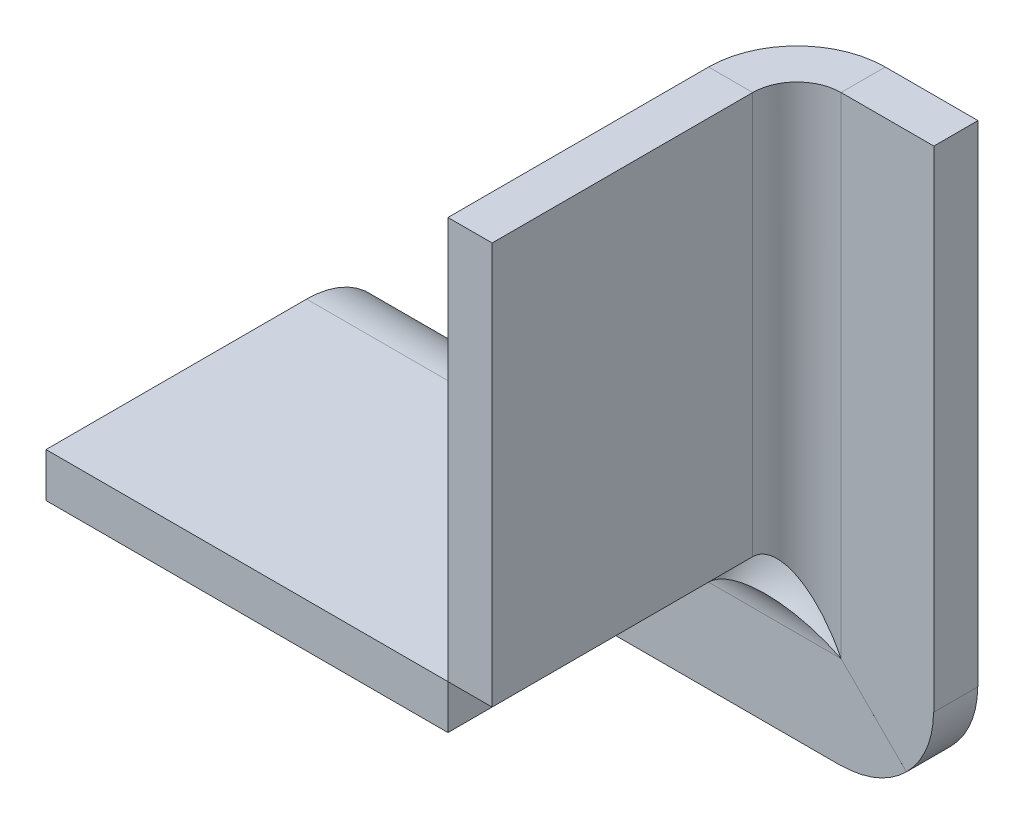
ISO-10303-21;
HEADER;
FILE_DESCRIPTION(('STEP AP214'),'2;1');
FILE_NAME('part.step','',(''),(''),'','','');
FILE_SCHEMA(('AUTOMOTIVE_DESIGN { 1 0 10303 214 1 1 1 1 }'));
ENDSEC;
DATA;
#1=APPLICATION_CONTEXT('core data for automotive mechanical design processes');
#2=APPLICATION_PROTOCOL_DEFINITION('international standard','automotive_design',2000,#1);
#3=PRODUCT_CONTEXT('',#1,'mechanical');
#4=PRODUCT('Part','Part','',(#3));
#5=PRODUCT_RELATED_PRODUCT_CATEGORY('part','',(#4));
#6=PRODUCT_DEFINITION_FORMATION('','',#4);
#7=PRODUCT_DEFINITION_CONTEXT('part definition',#1,'design');
#8=PRODUCT_DEFINITION('design','',#6,#7);
#9=PRODUCT_DEFINITION_SHAPE('','',#8);
#10=(LENGTH_UNIT() NAMED_UNIT(*) SI_UNIT(.MILLI.,.METRE.));
#11=(NAMED_UNIT(*) PLANE_ANGLE_UNIT() SI_UNIT($,.RADIAN.));
#12=(NAMED_UNIT(*) SI_UNIT($,.STERADIAN.) SOLID_ANGLE_UNIT());
#13=UNCERTAINTY_MEASURE_WITH_UNIT(LENGTH_MEASURE(1.E-05),#10,'distance_accuracy_value','');
#14=(GEOMETRIC_REPRESENTATION_CONTEXT(3) GLOBAL_UNCERTAINTY_ASSIGNED_CONTEXT((#13)) GLOBAL_UNIT_ASSIGNED_CONTEXT((#10,
#11,#12)) REPRESENTATION_CONTEXT('',''));
#15=CARTESIAN_POINT('',(0.,0.,0.));
#16=DIRECTION('',(0.,0.,1.));
#17=DIRECTION('',(1.,0.,0.));
#18=AXIS2_PLACEMENT_3D('',#15,#16,#17);
#19=CARTESIAN_POINT('',(0.,0.,-35.56));
#20=DIRECTION('',(-1.,0.,0.));
#21=DIRECTION('',(0.,0.,1.));
#22=AXIS2_PLACEMENT_3D('',#19,#20,#21);
#23=PLANE('',#22);
#24=DIRECTION('',(0.,-1.,0.));
#25=VECTOR('',#24,1.);
#26=CARTESIAN_POINT('',(0.,0.,-20.574));
#27=LINE('',#26,#25);
#28=CARTESIAN_POINT('',(0.,0.,-20.574));
#29=VERTEX_POINT('',#28);
#30=CARTESIAN_POINT('',(0.,2.54,-20.574));
#31=VERTEX_POINT('',#30);
#32=EDGE_CURVE('E149',#29,#31,#27,.F.);
#33=ORIENTED_EDGE('',*,*,#32,.T.);
#34=DIRECTION('',(0.,0.,1.));
#35=VECTOR('',#34,1.);
#36=CARTESIAN_POINT('',(0.,2.54,-35.56));
#37=LINE('',#36,#35);
#38=CARTESIAN_POINT('',(0.,2.54,-35.56));
#39=VERTEX_POINT('',#38);
#40=EDGE_CURVE('E179',#39,#31,#37,.T.);
#41=ORIENTED_EDGE('',*,*,#40,.F.);
#42=DIRECTION('',(0.,-1.,0.));
#43=VECTOR('',#42,1.);
#44=CARTESIAN_POINT('',(0.,0.,-35.56));
#45=LINE('',#44,#43);
#46=CARTESIAN_POINT('',(0.,0.,-35.56));
#47=VERTEX_POINT('',#46);
#48=EDGE_CURVE('E159',#47,#39,#45,.F.);
#49=ORIENTED_EDGE('',*,*,#48,.F.);
#50=DIRECTION('',(0.,0.,1.));
#51=VECTOR('',#50,1.);
#52=CARTESIAN_POINT('',(0.,0.,-35.56));
#53=LINE('',#52,#51);
#54=EDGE_CURVE('E152',#47,#29,#53,.T.);
#55=ORIENTED_EDGE('',*,*,#54,.T.);
#56=EDGE_LOOP('',(#33,#41,#49,#55));
#57=FACE_BOUND('',#56,.T.);
#58=ADVANCED_FACE('F55',(#57),#23,.T.);
#59=CARTESIAN_POINT('',(23.1138203948714,0.,-35.56));
#60=DIRECTION('',(-1.,0.,0.));
#61=DIRECTION('',(0.,0.,1.));
#62=AXIS2_PLACEMENT_3D('',#59,#60,#61);
#63=PLANE('',#62);
#64=DIRECTION('',(0.,-1.,0.));
#65=VECTOR('',#64,1.);
#66=CARTESIAN_POINT('',(23.1138203948714,0.,-20.574));
#67=LINE('',#66,#65);
#68=CARTESIAN_POINT('',(23.1138203948714,2.54,-20.574));
#69=VERTEX_POINT('',#68);
#70=CARTESIAN_POINT('',(23.1138203948714,0.,-20.574));
#71=VERTEX_POINT('',#70);
#72=EDGE_CURVE('E78',#69,#71,#67,.T.);
#73=ORIENTED_EDGE('',*,*,#72,.T.);
#74=DIRECTION('',(0.,0.,1.));
#75=VECTOR('',#74,1.);
#76=CARTESIAN_POINT('',(23.1138203948714,0.,-35.56));
#77=LINE('',#76,#75);
#78=CARTESIAN_POINT('',(23.1138203948841,0.,-35.56));
#79=VERTEX_POINT('',#78);
#80=EDGE_CURVE('E180',#71,#79,#77,.F.);
#81=ORIENTED_EDGE('',*,*,#80,.T.);
#82=DIRECTION('',(0.,-1.,0.));
#83=VECTOR('',#82,1.);
#84=CARTESIAN_POINT('',(23.1138203948841,0.,-35.56));
#85=LINE('',#84,#83);
#86=CARTESIAN_POINT('',(23.1138203948841,2.54,-35.56));
#87=VERTEX_POINT('',#86);
#88=EDGE_CURVE('E176',#79,#87,#85,.F.);
#89=ORIENTED_EDGE('',*,*,#88,.T.);
#90=DIRECTION('',(0.,0.,1.));
#91=VECTOR('',#90,1.);
#92=CARTESIAN_POINT('',(23.1138203948714,2.54,-35.56));
#93=LINE('',#92,#91);
#94=EDGE_CURVE('E208',#69,#87,#93,.F.);
#95=ORIENTED_EDGE('',*,*,#94,.F.);
#96=EDGE_LOOP('',(#73,#81,#89,#95));
#97=FACE_BOUND('',#96,.T.);
#98=ADVANCED_FACE('F261',(#97),#63,.F.);
#99=CARTESIAN_POINT('',(0.,2.54,-35.56));
#100=DIRECTION('',(0.,1.,0.));
#101=DIRECTION('',(0.,0.,1.));
#102=AXIS2_PLACEMENT_3D('',#99,#100,#101);
#103=PLANE('',#102);
#104=ORIENTED_EDGE('',*,*,#40,.T.);
#105=DIRECTION('',(-1.,0.,0.));
#106=VECTOR('',#105,1.);
#107=CARTESIAN_POINT('',(0.,2.54,-20.574));
#108=LINE('',#107,#106);
#109=EDGE_CURVE('E191',#69,#31,#108,.T.);
#110=ORIENTED_EDGE('',*,*,#109,.F.);
#111=ORIENTED_EDGE('',*,*,#94,.T.);
#112=DIRECTION('',(1.,0.,0.));
#113=VECTOR('',#112,1.);
#114=CARTESIAN_POINT('',(0.,2.54,-35.56));
#115=LINE('',#114,#113);
#116=EDGE_CURVE('E217',#39,#87,#115,.T.);
#117=ORIENTED_EDGE('',*,*,#116,.F.);
#118=EDGE_LOOP('',(#104,#110,#111,#117));
#119=FACE_BOUND('',#118,.T.);
#120=ADVANCED_FACE('F258',(#119),#103,.T.);
#121=CARTESIAN_POINT('',(0.,0.,-35.56));
#122=DIRECTION('',(0.,1.,0.));
#123=DIRECTION('',(0.,0.,1.));
#124=AXIS2_PLACEMENT_3D('',#121,#122,#123);
#125=PLANE('',#124);
#126=DIRECTION('',(-1.,0.,0.));
#127=VECTOR('',#126,1.);
#128=CARTESIAN_POINT('',(0.,0.,-20.574));
#129=LINE('',#128,#127);
#130=EDGE_CURVE('E205',#71,#29,#129,.T.);
#131=ORIENTED_EDGE('',*,*,#130,.T.);
#132=ORIENTED_EDGE('',*,*,#54,.F.);
#133=DIRECTION('',(1.,0.,0.));
#134=VECTOR('',#133,1.);
#135=CARTESIAN_POINT('',(0.,0.,-35.56));
#136=LINE('',#135,#134);
#137=EDGE_CURVE('E163',#47,#79,#136,.T.);
#138=ORIENTED_EDGE('',*,*,#137,.T.);
#139=ORIENTED_EDGE('',*,*,#80,.F.);
#140=EDGE_LOOP('',(#131,#132,#138,#139));
#141=FACE_BOUND('',#140,.T.);
#142=ADVANCED_FACE('F264',(#141),#125,.F.);
#143=CARTESIAN_POINT('',(0.,-2.54,-35.56));
#144=DIRECTION('',(-1.,0.,0.));
#145=DIRECTION('',(0.,0.,1.));
#146=AXIS2_PLACEMENT_3D('',#143,#144,#145);
#147=PLANE('',#146);
#148=ORIENTED_EDGE('',*,*,#48,.T.);
#149=CARTESIAN_POINT('',(0.,-2.54,-35.56));
#150=DIRECTION('',(1.,0.,0.));
#151=DIRECTION('',(0.,0.,-1.));
#152=AXIS2_PLACEMENT_3D('',#149,#150,#151);
#153=CIRCLE('',#152,5.08);
#154=CARTESIAN_POINT('',(0.,-2.54000000000001,-40.64));
#155=VERTEX_POINT('',#154);
#156=EDGE_CURVE('E162',#39,#155,#153,.F.);
#157=ORIENTED_EDGE('',*,*,#156,.T.);
#158=DIRECTION('',(0.,0.,1.));
#159=VECTOR('',#158,1.);
#160=CARTESIAN_POINT('',(0.,-2.54000000000001,-38.1));
#161=LINE('',#160,#159);
#162=CARTESIAN_POINT('',(0.,-2.54000000000001,-38.1));
#163=VERTEX_POINT('',#162);
#164=EDGE_CURVE('E164',#163,#155,#161,.F.);
#165=ORIENTED_EDGE('',*,*,#164,.F.);
#166=CARTESIAN_POINT('',(0.,-2.54,-35.56));
#167=DIRECTION('',(1.,0.,0.));
#168=DIRECTION('',(0.,0.,-1.));
#169=AXIS2_PLACEMENT_3D('',#166,#167,#168);
#170=CIRCLE('',#169,2.54);
#171=EDGE_CURVE('E183',#47,#163,#170,.F.);
#172=ORIENTED_EDGE('',*,*,#171,.F.);
#173=EDGE_LOOP('',(#148,#157,#165,#172));
#174=FACE_BOUND('',#173,.T.);
#175=ADVANCED_FACE('F253',(#174),#147,.T.);
#176=CARTESIAN_POINT('',(0.,0.,-38.1));
#177=DIRECTION('',(-1.,0.,0.));
#178=DIRECTION('',(0.,-1.,0.));
#179=AXIS2_PLACEMENT_3D('',#176,#177,#178);
#180=PLANE('',#179);
#181=ORIENTED_EDGE('',*,*,#164,.T.);
#182=DIRECTION('',(0.,-1.,0.));
#183=VECTOR('',#182,1.);
#184=CARTESIAN_POINT('',(0.,0.,-40.64));
#185=LINE('',#184,#183);
#186=CARTESIAN_POINT('',(0.,-7.87400000000001,-40.64));
#187=VERTEX_POINT('',#186);
#188=EDGE_CURVE('E167',#155,#187,#185,.T.);
#189=ORIENTED_EDGE('',*,*,#188,.T.);
#190=DIRECTION('',(0.,0.,1.));
#191=VECTOR('',#190,1.);
#192=CARTESIAN_POINT('',(0.,-7.874,-38.1));
#193=LINE('',#192,#191);
#194=CARTESIAN_POINT('',(0.,-7.874,-38.1));
#195=VERTEX_POINT('',#194);
#196=EDGE_CURVE('E168',#195,#187,#193,.F.);
#197=ORIENTED_EDGE('',*,*,#196,.F.);
#198=DIRECTION('',(0.,-1.,0.));
#199=VECTOR('',#198,1.);
#200=CARTESIAN_POINT('',(0.,0.,-38.1));
#201=LINE('',#200,#199);
#202=EDGE_CURVE('E188',#163,#195,#201,.T.);
#203=ORIENTED_EDGE('',*,*,#202,.F.);
#204=EDGE_LOOP('',(#181,#189,#197,#203));
#205=FACE_BOUND('',#204,.T.);
#206=ADVANCED_FACE('F233',(#205),#180,.T.);
#207=CARTESIAN_POINT('',(0.,-7.874,-38.1));
#208=DIRECTION('',(0.,-1.,0.));
#209=DIRECTION('',(1.,0.,0.));
#210=AXIS2_PLACEMENT_3D('',#207,#208,#209);
#211=PLANE('',#210);
#212=DIRECTION('',(1.,0.,0.));
#213=VECTOR('',#212,1.);
#214=CARTESIAN_POINT('',(0.,-7.87400000000001,-40.64));
#215=LINE('',#214,#213);
#216=CARTESIAN_POINT('',(28.1938203948577,-7.87400000000001,-40.64));
#217=VERTEX_POINT('',#216);
#218=EDGE_CURVE('E171',#187,#217,#215,.T.);
#219=ORIENTED_EDGE('',*,*,#218,.T.);
#220=DIRECTION('',(0.,0.,-1.));
#221=VECTOR('',#220,1.);
#222=CARTESIAN_POINT('',(28.1938203948577,-7.874,-38.1));
#223=LINE('',#222,#221);
#224=CARTESIAN_POINT('',(28.1938203948577,-7.874,-38.1));
#225=VERTEX_POINT('',#224);
#226=EDGE_CURVE('E132',#217,#225,#223,.F.);
#227=ORIENTED_EDGE('',*,*,#226,.T.);
#228=DIRECTION('',(1.,0.,0.));
#229=VECTOR('',#228,1.);
#230=CARTESIAN_POINT('',(0.,-7.874,-38.1));
#231=LINE('',#230,#229);
#232=EDGE_CURVE('E186',#195,#225,#231,.T.);
#233=ORIENTED_EDGE('',*,*,#232,.F.);
#234=ORIENTED_EDGE('',*,*,#196,.T.);
#235=EDGE_LOOP('',(#219,#227,#233,#234));
#236=FACE_BOUND('',#235,.T.);
#237=ADVANCED_FACE('F227',(#236),#211,.T.);
#238=CARTESIAN_POINT('',(12.8269101974288,12.8269101974288,-38.1));
#239=DIRECTION('',(0.707106781186547,0.707106781186548,0.));
#240=DIRECTION('',(-0.707106781186548,0.707106781186547,0.));
#241=AXIS2_PLACEMENT_3D('',#238,#239,#240);
#242=PLANE('',#241);
#243=DIRECTION('',(-0.707106781186548,0.707106781186547,0.));
#244=VECTOR('',#243,1.);
#245=CARTESIAN_POINT('',(12.8269101974288,12.8269101974288,-38.1));
#246=LINE('',#245,#244);
#247=CARTESIAN_POINT('',(31.9529549657332,-6.29913457087551,-38.1));
#248=VERTEX_POINT('',#247);
#249=CARTESIAN_POINT('',(28.1938203948577,-2.54000000000001,-38.1));
#250=VERTEX_POINT('',#249);
#251=EDGE_CURVE('E192',#248,#250,#246,.T.);
#252=ORIENTED_EDGE('',*,*,#251,.F.);
#253=DIRECTION('',(0.,0.,-1.));
#254=VECTOR('',#253,1.);
#255=CARTESIAN_POINT('',(31.9529549657332,-6.2991345708755,-20.574));
#256=LINE('',#255,#254);
#257=CARTESIAN_POINT('',(31.9529549657332,-6.29913457087552,-40.64));
#258=VERTEX_POINT('',#257);
#259=EDGE_CURVE('E136',#248,#258,#256,.T.);
#260=ORIENTED_EDGE('',*,*,#259,.T.);
#261=DIRECTION('',(-0.707106781186548,0.707106781186547,0.));
#262=VECTOR('',#261,1.);
#263=CARTESIAN_POINT('',(12.8269101974288,12.8269101974288,-40.64));
#264=LINE('',#263,#262);
#265=CARTESIAN_POINT('',(28.1938203948577,-2.54000000000001,-40.64));
#266=VERTEX_POINT('',#265);
#267=EDGE_CURVE('E148',#258,#266,#264,.T.);
#268=ORIENTED_EDGE('',*,*,#267,.T.);
#269=DIRECTION('',(0.,0.,1.));
#270=VECTOR('',#269,1.);
#271=CARTESIAN_POINT('',(28.1938203948577,-2.54000000000001,-38.1));
#272=LINE('',#271,#270);
#273=EDGE_CURVE('E172',#250,#266,#272,.F.);
#274=ORIENTED_EDGE('',*,*,#273,.F.);
#275=EDGE_LOOP('',(#252,#260,#268,#274));
#276=FACE_BOUND('',#275,.T.);
#277=ADVANCED_FACE('F247',(#276),#242,.T.);
#278=CARTESIAN_POINT('',(33.2738203948841,-5.08,-35.56));
#279=CARTESIAN_POINT('',(33.2738203948841,-5.92666666666667,-35.56));
#280=CARTESIAN_POINT('',(33.2738203948841,-6.77333333333334,-35.56));
#281=CARTESIAN_POINT('',(33.2738203948841,-7.62000000000001,-35.56));
#282=CARTESIAN_POINT('',(33.2738203948841,-5.08,-40.64));
#283=CARTESIAN_POINT('',(33.2738203948841,-5.92666666666667,-42.3333333333333));
#284=CARTESIAN_POINT('',(33.2738203948841,-6.77333333333334,-44.0266666666667));
#285=CARTESIAN_POINT('',(33.2738203948841,-7.62000000000001,-45.72));
#286=CARTESIAN_POINT('',(23.1138203948841,0.,-40.64));
#287=CARTESIAN_POINT('',(23.1138203948841,0.846666666666661,-42.3333333333333));
#288=CARTESIAN_POINT('',(23.1138203948841,1.69333333333333,-44.0266666666667));
#289=CARTESIAN_POINT('',(23.1138203948841,2.53999999999999,-45.72));
#290=CARTESIAN_POINT('',(23.1138203948841,0.,-35.56));
#291=CARTESIAN_POINT('',(23.1138203948841,0.846666666666662,-35.56));
#292=CARTESIAN_POINT('',(23.1138203948841,1.69333333333333,-35.56));
#293=CARTESIAN_POINT('',(23.1138203948841,2.54,-35.56));
#294=CARTESIAN_POINT('',(23.1138203948841,0.,-30.48));
#295=CARTESIAN_POINT('',(23.1138203948841,0.846666666666663,-28.7866666666667));
#296=CARTESIAN_POINT('',(23.1138203948841,1.69333333333333,-27.0933333333333));
#297=CARTESIAN_POINT('',(23.1138203948841,2.54,-25.4));
#298=CARTESIAN_POINT('',(33.2738203948841,-5.08,-30.48));
#299=CARTESIAN_POINT('',(33.2738203948841,-5.92666666666667,-28.7866666666667));
#300=CARTESIAN_POINT('',(33.2738203948841,-6.77333333333334,-27.0933333333333));
#301=CARTESIAN_POINT('',(33.2738203948841,-7.62000000000001,-25.4));
#302=CARTESIAN_POINT('',(33.2738203948841,-5.08,-35.56));
#303=CARTESIAN_POINT('',(33.2738203948841,-5.92666666666667,-35.56));
#304=CARTESIAN_POINT('',(33.2738203948841,-6.77333333333334,-35.56));
#305=CARTESIAN_POINT('',(33.2738203948841,-7.62000000000001,-35.56));
#306=(BOUNDED_SURFACE() B_SPLINE_SURFACE(3,3,((#278,#279,#280,#281),(#282,#283,#284,#285),(#286,
#287,#288,#289),(#290,#291,#292,#293),(#294,#295,#296,#297),(#298,#299,#300,#301),(#302,#303,
#304,#305)),.UNSPECIFIED.,.T.,.F.,.F.) B_SPLINE_SURFACE_WITH_KNOTS((4,3,4),(4,4),(0.,0.5,1.),
(0.,1.),.UNSPECIFIED.) GEOMETRIC_REPRESENTATION_ITEM() RATIONAL_B_SPLINE_SURFACE(((1.,1.,1.,1.),
(0.333333333333333,0.333333333333333,0.333333333333333,0.333333333333333),(0.333333333333333,
0.333333333333333,0.333333333333333,0.333333333333333),(1.,1.,1.,1.),(0.333333333333333,
0.333333333333333,0.333333333333333,0.333333333333333),(0.333333333333333,0.333333333333333,
0.333333333333333,0.333333333333333),(1.,1.,1.,1.))) REPRESENTATION_ITEM('') SURFACE());
#307=CARTESIAN_POINT('',(28.1938203948841,-2.54,-35.56));
#308=DIRECTION('',(0.707106781186547,0.707106781186548,0.));
#309=DIRECTION('',(0.707106781186548,-0.707106781186547,0.));
#310=AXIS2_PLACEMENT_3D('',#307,#308,#309);
#311=ELLIPSE('',#310,7.18420489685533,5.08);
#312=EDGE_CURVE('E175',#266,#87,#311,.T.);
#313=CARTESIAN_POINT('',(28.1938203948841,-2.54,-35.56));
#314=DIRECTION('',(0.447213595499958,0.894427190999916,0.));
#315=DIRECTION('',(0.894427190999916,-0.447213595499958,0.));
#316=AXIS2_PLACEMENT_3D('',#313,#314,#315);
#317=ELLIPSE('',#316,5.67961266284947,2.54);
#318=EDGE_CURVE('E187',#250,#79,#317,.T.);
#319=ORIENTED_EDGE('',*,*,#273,.T.);
#320=ORIENTED_EDGE('',*,*,#312,.T.);
#321=ORIENTED_EDGE('',*,*,#88,.F.);
#322=ORIENTED_EDGE('',*,*,#318,.F.);
#323=EDGE_LOOP('',(#319,#320,#321,#322));
#324=FACE_BOUND('',#323,.T.);
#325=ADVANCED_FACE('F244',(#324),#306,.F.);
#326=CARTESIAN_POINT('',(0.,-2.54,-35.56));
#327=DIRECTION('',(1.,0.,0.));
#328=DIRECTION('',(0.,0.,-1.));
#329=AXIS2_PLACEMENT_3D('',#326,#327,#328);
#330=CYLINDRICAL_SURFACE('',#329,5.08);
#331=DIRECTION('',(1.,0.,0.));
#332=VECTOR('',#331,1.);
#333=CARTESIAN_POINT('',(0.,-2.54000000000001,-40.64));
#334=LINE('',#333,#332);
#335=EDGE_CURVE('E202',#155,#266,#334,.T.);
#336=ORIENTED_EDGE('',*,*,#335,.F.);
#337=ORIENTED_EDGE('',*,*,#156,.F.);
#338=ORIENTED_EDGE('',*,*,#116,.T.);
#339=ORIENTED_EDGE('',*,*,#312,.F.);
#340=EDGE_LOOP('',(#336,#337,#338,#339));
#341=FACE_BOUND('',#340,.T.);
#342=ADVANCED_FACE('F239',(#341),#330,.T.);
#343=CARTESIAN_POINT('',(0.,0.,-40.64));
#344=DIRECTION('',(0.,0.,1.));
#345=DIRECTION('',(0.,-1.,0.));
#346=AXIS2_PLACEMENT_3D('',#343,#344,#345);
#347=PLANE('',#346);
#348=ORIENTED_EDGE('',*,*,#267,.F.);
#349=CARTESIAN_POINT('',(28.1938203948577,-2.54000000000001,-40.64));
#350=DIRECTION('',(0.,0.,1.));
#351=DIRECTION('',(0.,-1.,0.));
#352=AXIS2_PLACEMENT_3D('',#349,#350,#351);
#353=CIRCLE('',#352,5.3162190929177);
#354=CARTESIAN_POINT('',(28.1938203948577,-7.85621909291771,-40.640006));
#355=VERTEX_POINT('',#354);
#356=EDGE_CURVE('E140',#258,#355,#353,.F.);
#357=ORIENTED_EDGE('',*,*,#356,.T.);
#358=DIRECTION('',(0.,-1.,0.));
#359=VECTOR('',#358,1.);
#360=CARTESIAN_POINT('',(28.1938203948577,0.,-40.64));
#361=LINE('',#360,#359);
#362=EDGE_CURVE('E129',#355,#217,#361,.T.);
#363=ORIENTED_EDGE('',*,*,#362,.T.);
#364=ORIENTED_EDGE('',*,*,#218,.F.);
#365=ORIENTED_EDGE('',*,*,#188,.F.);
#366=ORIENTED_EDGE('',*,*,#335,.T.);
#367=EDGE_LOOP('',(#348,#357,#363,#364,#365,#366));
#368=FACE_BOUND('',#367,.T.);
#369=ADVANCED_FACE('F146',(#368),#347,.F.);
#370=CARTESIAN_POINT('',(0.,-2.54,-35.56));
#371=DIRECTION('',(1.,0.,0.));
#372=DIRECTION('',(0.,0.,-1.));
#373=AXIS2_PLACEMENT_3D('',#370,#371,#372);
#374=CYLINDRICAL_SURFACE('',#373,2.54);
#375=DIRECTION('',(1.,0.,0.));
#376=VECTOR('',#375,1.);
#377=CARTESIAN_POINT('',(0.,-2.54000000000001,-38.1));
#378=LINE('',#377,#376);
#379=EDGE_CURVE('E198',#163,#250,#378,.T.);
#380=ORIENTED_EDGE('',*,*,#379,.T.);
#381=ORIENTED_EDGE('',*,*,#318,.T.);
#382=ORIENTED_EDGE('',*,*,#137,.F.);
#383=ORIENTED_EDGE('',*,*,#171,.T.);
#384=EDGE_LOOP('',(#380,#381,#382,#383));
#385=FACE_BOUND('',#384,.T.);
#386=ADVANCED_FACE('F249',(#385),#374,.F.);
#387=CARTESIAN_POINT('',(0.,0.,-38.1));
#388=DIRECTION('',(0.,0.,1.));
#389=DIRECTION('',(0.,-1.,0.));
#390=AXIS2_PLACEMENT_3D('',#387,#388,#389);
#391=PLANE('',#390);
#392=CARTESIAN_POINT('',(28.1938203948577,-2.54000000000001,-38.1));
#393=DIRECTION('',(0.,0.,1.));
#394=DIRECTION('',(0.,-1.,0.));
#395=AXIS2_PLACEMENT_3D('',#392,#393,#394);
#396=CIRCLE('',#395,5.3162190929177);
#397=CARTESIAN_POINT('',(28.1938203948577,-7.85621909291771,-38.1));
#398=VERTEX_POINT('',#397);
#399=EDGE_CURVE('E12',#248,#398,#396,.F.);
#400=ORIENTED_EDGE('',*,*,#399,.F.);
#401=ORIENTED_EDGE('',*,*,#251,.T.);
#402=ORIENTED_EDGE('',*,*,#379,.F.);
#403=ORIENTED_EDGE('',*,*,#202,.T.);
#404=ORIENTED_EDGE('',*,*,#232,.T.);
#405=DIRECTION('',(0.,-1.,0.));
#406=VECTOR('',#405,1.);
#407=CARTESIAN_POINT('',(28.1938203948577,0.,-38.1));
#408=LINE('',#407,#406);
#409=EDGE_CURVE('E63',#398,#225,#408,.T.);
#410=ORIENTED_EDGE('',*,*,#409,.F.);
#411=EDGE_LOOP('',(#400,#401,#402,#403,#404,#410));
#412=FACE_BOUND('',#411,.T.);
#413=ADVANCED_FACE('F229',(#412),#391,.T.);
#414=CARTESIAN_POINT('',(0.,0.,-20.574));
#415=DIRECTION('',(0.,0.,1.));
#416=DIRECTION('',(1.,0.,0.));
#417=AXIS2_PLACEMENT_3D('',#414,#415,#416);
#418=PLANE('',#417);
#419=ORIENTED_EDGE('',*,*,#109,.T.);
#420=ORIENTED_EDGE('',*,*,#32,.F.);
#421=ORIENTED_EDGE('',*,*,#130,.F.);
#422=ORIENTED_EDGE('',*,*,#72,.F.);
#423=EDGE_LOOP('',(#419,#420,#421,#422));
#424=FACE_BOUND('',#423,.T.);
#425=ADVANCED_FACE('F57',(#424),#418,.T.);
#426=CARTESIAN_POINT('',(28.1938203948577,-2.53999999999999,-20.574));
#427=DIRECTION('',(0.,0.,-1.));
#428=DIRECTION('',(0.,1.,0.));
#429=AXIS2_PLACEMENT_3D('',#426,#427,#428);
#430=CYLINDRICAL_SURFACE('',#429,5.3162190929177);
#431=ORIENTED_EDGE('',*,*,#259,.F.);
#432=ORIENTED_EDGE('',*,*,#399,.T.);
#433=DIRECTION('',(0.,0.,-1.));
#434=VECTOR('',#433,1.);
#435=CARTESIAN_POINT('',(28.1938203948577,-7.8562190929177,-20.574));
#436=LINE('',#435,#434);
#437=EDGE_CURVE('E70',#398,#355,#436,.T.);
#438=ORIENTED_EDGE('',*,*,#437,.T.);
#439=ORIENTED_EDGE('',*,*,#356,.F.);
#440=EDGE_LOOP('',(#431,#432,#438,#439));
#441=FACE_BOUND('',#440,.T.);
#442=ADVANCED_FACE('F139',(#441),#430,.T.);
#443=CARTESIAN_POINT('',(28.1938203948577,-12.5066001103188,-20.574));
#444=DIRECTION('',(-1.,0.,0.));
#445=DIRECTION('',(0.,0.,1.));
#446=AXIS2_PLACEMENT_3D('',#443,#444,#445);
#447=PLANE('',#446);
#448=ORIENTED_EDGE('',*,*,#437,.F.);
#449=ORIENTED_EDGE('',*,*,#409,.T.);
#450=ORIENTED_EDGE('',*,*,#226,.F.);
#451=ORIENTED_EDGE('',*,*,#362,.F.);
#452=EDGE_LOOP('',(#448,#449,#450,#451));
#453=FACE_BOUND('',#452,.T.);
#454=ADVANCED_FACE('F130',(#453),#447,.F.);
#455=CLOSED_SHELL('',(#58,#98,#120,#142,#175,#206,#237,#277,#325,#342,#369,#386,#413,#425,#442,#454));
#456=MANIFOLD_SOLID_BREP('B2',#455);
#457=CARTESIAN_POINT('',(33.528,-128.27,-38.1));
#458=DIRECTION('',(1.,0.,0.));
#459=DIRECTION('',(0.,1.,0.));
#460=AXIS2_PLACEMENT_3D('',#457,#458,#459);
#461=PLANE('',#460);
#462=DIRECTION('',(0.,1.,0.));
#463=VECTOR('',#462,1.);
#464=CARTESIAN_POINT('',(33.528,-128.27,-38.1));
#465=LINE('',#464,#463);
#466=CARTESIAN_POINT('',(33.5280000000018,-2.54000000000001,-38.1));
#467=VERTEX_POINT('',#466);
#468=CARTESIAN_POINT('',(33.5280000000022,25.654,-38.1));
#469=VERTEX_POINT('',#468);
#470=EDGE_CURVE('E604',#467,#469,#465,.T.);
#471=ORIENTED_EDGE('',*,*,#470,.F.);
#472=DIRECTION('',(0.,0.,1.));
#473=VECTOR('',#472,1.);
#474=CARTESIAN_POINT('',(33.5280000000018,-2.54000000000001,-38.1000000000001));
#475=LINE('',#474,#473);
#476=CARTESIAN_POINT('',(33.5280000000018,-2.54000000000002,-40.64));
#477=VERTEX_POINT('',#476);
#478=EDGE_CURVE('E479',#467,#477,#475,.F.);
#479=ORIENTED_EDGE('',*,*,#478,.T.);
#480=DIRECTION('',(0.,1.,0.));
#481=VECTOR('',#480,1.);
#482=CARTESIAN_POINT('',(33.528,-128.27,-40.64));
#483=LINE('',#482,#481);
#484=CARTESIAN_POINT('',(33.5280000000022,25.654,-40.64));
#485=VERTEX_POINT('',#484);
#486=EDGE_CURVE('E559',#477,#485,#483,.T.);
#487=ORIENTED_EDGE('',*,*,#486,.T.);
#488=DIRECTION('',(0.,0.,1.));
#489=VECTOR('',#488,1.);
#490=CARTESIAN_POINT('',(33.5280000000022,25.654,-38.1));
#491=LINE('',#490,#489);
#492=EDGE_CURVE('E584',#469,#485,#491,.F.);
#493=ORIENTED_EDGE('',*,*,#492,.F.);
#494=EDGE_LOOP('',(#471,#479,#487,#493));
#495=FACE_BOUND('',#494,.T.);
#496=ADVANCED_FACE('F464',(#495),#461,.T.);
#497=CARTESIAN_POINT('',(25.6540000000022,25.6540000000001,-38.1));
#498=DIRECTION('',(0.,-1.,0.));
#499=DIRECTION('',(1.,0.,0.));
#500=AXIS2_PLACEMENT_3D('',#497,#498,#499);
#501=PLANE('',#500);
#502=ORIENTED_EDGE('',*,*,#492,.T.);
#503=DIRECTION('',(1.,0.,0.));
#504=VECTOR('',#503,1.);
#505=CARTESIAN_POINT('',(25.6540000000022,25.6540000000001,-40.64));
#506=LINE('',#505,#504);
#507=CARTESIAN_POINT('',(28.1940000000022,25.654,-40.64));
#508=VERTEX_POINT('',#507);
#509=EDGE_CURVE('E587',#485,#508,#506,.F.);
#510=ORIENTED_EDGE('',*,*,#509,.T.);
#511=DIRECTION('',(0.,0.,1.));
#512=VECTOR('',#511,1.);
#513=CARTESIAN_POINT('',(28.1940000000022,25.654,-38.1));
#514=LINE('',#513,#512);
#515=CARTESIAN_POINT('',(28.1940000000022,25.654,-38.1));
#516=VERTEX_POINT('',#515);
#517=EDGE_CURVE('E588',#516,#508,#514,.F.);
#518=ORIENTED_EDGE('',*,*,#517,.F.);
#519=DIRECTION('',(1.,0.,0.));
#520=VECTOR('',#519,1.);
#521=CARTESIAN_POINT('',(25.6540000000022,25.6540000000001,-38.1));
#522=LINE('',#521,#520);
#523=EDGE_CURVE('E607',#469,#516,#522,.F.);
#524=ORIENTED_EDGE('',*,*,#523,.F.);
#525=EDGE_LOOP('',(#502,#510,#518,#524));
#526=FACE_BOUND('',#525,.T.);
#527=ADVANCED_FACE('F651',(#526),#501,.F.);
#528=CARTESIAN_POINT('',(89.7890898025811,-64.1349101974188,-38.0999999999999));
#529=DIRECTION('',(-0.707106781186547,-0.707106781186548,0.));
#530=DIRECTION('',(0.707106781186548,-0.707106781186547,0.));
#531=AXIS2_PLACEMENT_3D('',#528,#529,#530);
#532=PLANE('',#531);
#533=DIRECTION('',(0.707106781186548,-0.707106781186547,0.));
#534=VECTOR('',#533,1.);
#535=CARTESIAN_POINT('',(89.7890898025811,-64.1349101974188,-40.6399999999999));
#536=LINE('',#535,#534);
#537=CARTESIAN_POINT('',(28.1940000000018,-2.53982039483952,-40.64));
#538=VERTEX_POINT('',#537);
#539=CARTESIAN_POINT('',(31.9531345665948,-6.29895496143262,-40.64));
#540=VERTEX_POINT('',#539);
#541=EDGE_CURVE('E583',#538,#540,#536,.T.);
#542=ORIENTED_EDGE('',*,*,#541,.T.);
#543=DIRECTION('',(0.,0.,-1.));
#544=VECTOR('',#543,1.);
#545=CARTESIAN_POINT('',(31.9531345665948,-6.2989549614326,-20.574));
#546=LINE('',#545,#544);
#547=CARTESIAN_POINT('',(31.9531345665949,-6.2989549614326,-38.1));
#548=VERTEX_POINT('',#547);
#549=EDGE_CURVE('E546',#540,#548,#546,.F.);
#550=ORIENTED_EDGE('',*,*,#549,.T.);
#551=DIRECTION('',(0.707106781186548,-0.707106781186547,0.));
#552=VECTOR('',#551,1.);
#553=CARTESIAN_POINT('',(89.7890898025811,-64.1349101974188,-38.0999999999999));
#554=LINE('',#553,#552);
#555=CARTESIAN_POINT('',(28.1940000000018,-2.53982039483952,-38.1));
#556=VERTEX_POINT('',#555);
#557=EDGE_CURVE('E601',#556,#548,#554,.T.);
#558=ORIENTED_EDGE('',*,*,#557,.F.);
#559=DIRECTION('',(0.,0.,1.));
#560=VECTOR('',#559,1.);
#561=CARTESIAN_POINT('',(28.1940000000018,-2.53982039483952,-38.1));
#562=LINE('',#561,#560);
#563=EDGE_CURVE('E575',#556,#538,#562,.F.);
#564=ORIENTED_EDGE('',*,*,#563,.T.);
#565=EDGE_LOOP('',(#542,#550,#558,#564));
#566=FACE_BOUND('',#565,.T.);
#567=ADVANCED_FACE('F678',(#566),#532,.T.);
#568=CARTESIAN_POINT('',(25.654,-128.27,-40.64));
#569=DIRECTION('',(0.,0.,1.));
#570=DIRECTION('',(1.,0.,0.));
#571=AXIS2_PLACEMENT_3D('',#568,#569,#570);
#572=PLANE('',#571);
#573=DIRECTION('',(-1.,0.,0.));
#574=VECTOR('',#573,1.);
#575=CARTESIAN_POINT('',(25.654,-2.54000000000001,-40.64));
#576=LINE('',#575,#574);
#577=CARTESIAN_POINT('',(33.5100394877754,-2.54000000000001,-40.64));
#578=VERTEX_POINT('',#577);
#579=EDGE_CURVE('E554',#477,#578,#576,.T.);
#580=ORIENTED_EDGE('',*,*,#579,.T.);
#581=CARTESIAN_POINT('',(28.1938203948577,-2.54000000000001,-40.64));
#582=DIRECTION('',(0.,0.,1.));
#583=DIRECTION('',(1.,0.,0.));
#584=AXIS2_PLACEMENT_3D('',#581,#582,#583);
#585=CIRCLE('',#584,5.3162190929177);
#586=EDGE_CURVE('E540',#578,#540,#585,.F.);
#587=ORIENTED_EDGE('',*,*,#586,.T.);
#588=ORIENTED_EDGE('',*,*,#541,.F.);
#589=DIRECTION('',(0.,1.,0.));
#590=VECTOR('',#589,1.);
#591=CARTESIAN_POINT('',(28.194,-128.27,-40.64));
#592=LINE('',#591,#590);
#593=EDGE_CURVE('E618',#538,#508,#592,.T.);
#594=ORIENTED_EDGE('',*,*,#593,.T.);
#595=ORIENTED_EDGE('',*,*,#509,.F.);
#596=ORIENTED_EDGE('',*,*,#486,.F.);
#597=EDGE_LOOP('',(#580,#587,#588,#594,#595,#596));
#598=FACE_BOUND('',#597,.T.);
#599=ADVANCED_FACE('F557',(#598),#572,.F.);
#600=CARTESIAN_POINT('',(25.654,-128.27,-38.1));
#601=DIRECTION('',(0.,0.,1.));
#602=DIRECTION('',(1.,0.,0.));
#603=AXIS2_PLACEMENT_3D('',#600,#601,#602);
#604=PLANE('',#603);
#605=CARTESIAN_POINT('',(28.1938203948577,-2.54000000000001,-38.1));
#606=DIRECTION('',(0.,0.,1.));
#607=DIRECTION('',(1.,0.,0.));
#608=AXIS2_PLACEMENT_3D('',#605,#606,#607);
#609=CIRCLE('',#608,5.3162190929177);
#610=CARTESIAN_POINT('',(33.5100394877754,-2.54000000000001,-38.1));
#611=VERTEX_POINT('',#610);
#612=EDGE_CURVE('E53',#611,#548,#609,.F.);
#613=ORIENTED_EDGE('',*,*,#612,.F.);
#614=DIRECTION('',(-1.,0.,0.));
#615=VECTOR('',#614,1.);
#616=CARTESIAN_POINT('',(25.654,-2.54000000000001,-38.1));
#617=LINE('',#616,#615);
#618=EDGE_CURVE('E472',#467,#611,#617,.T.);
#619=ORIENTED_EDGE('',*,*,#618,.F.);
#620=ORIENTED_EDGE('',*,*,#470,.T.);
#621=ORIENTED_EDGE('',*,*,#523,.T.);
#622=DIRECTION('',(0.,1.,0.));
#623=VECTOR('',#622,1.);
#624=CARTESIAN_POINT('',(28.194,-128.27,-38.1));
#625=LINE('',#624,#623);
#626=EDGE_CURVE('E599',#556,#516,#625,.T.);
#627=ORIENTED_EDGE('',*,*,#626,.F.);
#628=ORIENTED_EDGE('',*,*,#557,.T.);
#629=EDGE_LOOP('',(#613,#619,#620,#621,#627,#628));
#630=FACE_BOUND('',#629,.T.);
#631=ADVANCED_FACE('F670',(#630),#604,.T.);
#632=CARTESIAN_POINT('',(28.1940000000022,25.654,-35.56));
#633=DIRECTION('',(0.,-1.,0.));
#634=DIRECTION('',(1.,0.,0.));
#635=AXIS2_PLACEMENT_3D('',#632,#633,#634);
#636=PLANE('',#635);
#637=ORIENTED_EDGE('',*,*,#517,.T.);
#638=CARTESIAN_POINT('',(28.1940000000022,25.654,-35.56));
#639=DIRECTION('',(0.,1.,0.));
#640=DIRECTION('',(-1.,0.,0.));
#641=AXIS2_PLACEMENT_3D('',#638,#639,#640);
#642=CIRCLE('',#641,5.08);
#643=CARTESIAN_POINT('',(23.1140000000022,25.6540000000001,-35.5599999999999));
#644=VERTEX_POINT('',#643);
#645=EDGE_CURVE('E591',#508,#644,#642,.T.);
#646=ORIENTED_EDGE('',*,*,#645,.T.);
#647=DIRECTION('',(1.,0.,0.));
#648=VECTOR('',#647,1.);
#649=CARTESIAN_POINT('',(25.6540000000022,25.654,-35.56));
#650=LINE('',#649,#648);
#651=CARTESIAN_POINT('',(25.6540000000022,25.654,-35.56));
#652=VERTEX_POINT('',#651);
#653=EDGE_CURVE('E592',#652,#644,#650,.F.);
#654=ORIENTED_EDGE('',*,*,#653,.F.);
#655=CARTESIAN_POINT('',(28.1940000000022,25.654,-35.56));
#656=DIRECTION('',(0.,1.,0.));
#657=DIRECTION('',(-1.,0.,0.));
#658=AXIS2_PLACEMENT_3D('',#655,#656,#657);
#659=CIRCLE('',#658,2.54);
#660=EDGE_CURVE('E605',#516,#652,#659,.T.);
#661=ORIENTED_EDGE('',*,*,#660,.F.);
#662=EDGE_LOOP('',(#637,#646,#654,#661));
#663=FACE_BOUND('',#662,.T.);
#664=ADVANCED_FACE('F647',(#663),#636,.F.);
#665=CARTESIAN_POINT('',(25.6540000000018,2.54017960513389,-35.56));
#666=CARTESIAN_POINT('',(24.8073333333352,2.5401796051339,-35.56));
#667=CARTESIAN_POINT('',(23.9606666666685,2.54017960513391,-35.56));
#668=CARTESIAN_POINT('',(23.1140000000018,2.54017960513392,-35.56));
#669=CARTESIAN_POINT('',(25.6540000000018,2.54017960513389,-40.64));
#670=CARTESIAN_POINT('',(24.8073333333352,2.5401796051339,-42.3333333333333));
#671=CARTESIAN_POINT('',(23.9606666666685,2.54017960513391,-44.0266666666667));
#672=CARTESIAN_POINT('',(23.1140000000018,2.54017960513392,-45.72));
#673=CARTESIAN_POINT('',(30.7340000000017,-7.61982039486589,-40.64));
#674=CARTESIAN_POINT('',(31.5806666666684,-7.6198203948659,-42.3333333333333));
#675=CARTESIAN_POINT('',(32.427333333335,-7.61982039486591,-44.0266666666667));
#676=CARTESIAN_POINT('',(33.2740000000017,-7.61982039486592,-45.72));
#677=CARTESIAN_POINT('',(30.7340000000017,-7.61982039486589,-35.56));
#678=CARTESIAN_POINT('',(31.5806666666684,-7.6198203948659,-35.56));
#679=CARTESIAN_POINT('',(32.427333333335,-7.61982039486591,-35.56));
#680=CARTESIAN_POINT('',(33.2740000000017,-7.61982039486592,-35.56));
#681=CARTESIAN_POINT('',(30.7340000000017,-7.61982039486589,-30.48));
#682=CARTESIAN_POINT('',(31.5806666666684,-7.6198203948659,-28.7866666666667));
#683=CARTESIAN_POINT('',(32.427333333335,-7.61982039486591,-27.0933333333333));
#684=CARTESIAN_POINT('',(33.2740000000017,-7.61982039486592,-25.4));
#685=CARTESIAN_POINT('',(25.6540000000018,2.54017960513389,-30.48));
#686=CARTESIAN_POINT('',(24.8073333333352,2.5401796051339,-28.7866666666667));
#687=CARTESIAN_POINT('',(23.9606666666685,2.54017960513391,-27.0933333333333));
#688=CARTESIAN_POINT('',(23.1140000000018,2.54017960513392,-25.4));
#689=CARTESIAN_POINT('',(25.6540000000018,2.54017960513389,-35.56));
#690=CARTESIAN_POINT('',(24.8073333333352,2.5401796051339,-35.56));
#691=CARTESIAN_POINT('',(23.9606666666685,2.54017960513391,-35.56));
#692=CARTESIAN_POINT('',(23.1140000000018,2.54017960513392,-35.56));
#693=(BOUNDED_SURFACE() B_SPLINE_SURFACE(3,3,((#665,#666,#667,#668),(#669,#670,#671,#672),(#673,
#674,#675,#676),(#677,#678,#679,#680),(#681,#682,#683,#684),(#685,#686,#687,#688),(#689,#690,
#691,#692)),.UNSPECIFIED.,.T.,.F.,.F.) B_SPLINE_SURFACE_WITH_KNOTS((4,3,4),(4,4),(0.,0.5,1.),
(0.,1.),.UNSPECIFIED.) GEOMETRIC_REPRESENTATION_ITEM() RATIONAL_B_SPLINE_SURFACE(((1.,1.,1.,1.),
(0.333333333333333,0.333333333333333,0.333333333333333,0.333333333333333),(0.333333333333333,
0.333333333333333,0.333333333333333,0.333333333333333),(1.,1.,1.,1.),(0.333333333333333,
0.333333333333333,0.333333333333333,0.333333333333333),(0.333333333333333,0.333333333333333,
0.333333333333333,0.333333333333333),(1.,1.,1.,1.))) REPRESENTATION_ITEM('') SURFACE());
#694=CARTESIAN_POINT('',(28.1940000000018,-2.539820394866,-35.56));
#695=DIRECTION('',(-0.894427190999917,-0.447213595499956,0.));
#696=DIRECTION('',(-0.447213595499956,0.894427190999917,0.));
#697=AXIS2_PLACEMENT_3D('',#694,#695,#696);
#698=ELLIPSE('',#697,5.67961266284934,2.54);
#699=CARTESIAN_POINT('',(25.6540000000018,2.54017960513392,-35.56));
#700=VERTEX_POINT('',#699);
#701=EDGE_CURVE('E596',#700,#556,#698,.T.);
#702=DIRECTION('',(1.,0.,0.));
#703=VECTOR('',#702,1.);
#704=CARTESIAN_POINT('',(25.6540000000018,2.54017960513392,-35.56));
#705=LINE('',#704,#703);
#706=CARTESIAN_POINT('',(23.1140000000018,2.54017960513395,-35.56));
#707=VERTEX_POINT('',#706);
#708=EDGE_CURVE('E576',#700,#707,#705,.F.);
#709=CARTESIAN_POINT('',(28.1940000000018,-2.539820394866,-35.56));
#710=DIRECTION('',(-0.707106781186547,-0.707106781186548,0.));
#711=DIRECTION('',(-0.707106781186548,0.707106781186547,0.));
#712=AXIS2_PLACEMENT_3D('',#709,#710,#711);
#713=ELLIPSE('',#712,7.18420489685522,5.08);
#714=EDGE_CURVE('E579',#707,#538,#713,.T.);
#715=ORIENTED_EDGE('',*,*,#701,.F.);
#716=ORIENTED_EDGE('',*,*,#708,.T.);
#717=ORIENTED_EDGE('',*,*,#714,.T.);
#718=ORIENTED_EDGE('',*,*,#563,.F.);
#719=EDGE_LOOP('',(#715,#716,#717,#718));
#720=FACE_BOUND('',#719,.T.);
#721=ADVANCED_FACE('F656',(#720),#693,.F.);
#722=CARTESIAN_POINT('',(28.194,-128.27,-35.56));
#723=DIRECTION('',(0.,1.,0.));
#724=DIRECTION('',(0.,0.,-1.));
#725=AXIS2_PLACEMENT_3D('',#722,#723,#724);
#726=CYLINDRICAL_SURFACE('',#725,5.08);
#727=DIRECTION('',(0.,1.,0.));
#728=VECTOR('',#727,1.);
#729=CARTESIAN_POINT('',(23.114,-128.27,-35.56));
#730=LINE('',#729,#728);
#731=EDGE_CURVE('E630',#707,#644,#730,.T.);
#732=ORIENTED_EDGE('',*,*,#731,.T.);
#733=ORIENTED_EDGE('',*,*,#645,.F.);
#734=ORIENTED_EDGE('',*,*,#593,.F.);
#735=ORIENTED_EDGE('',*,*,#714,.F.);
#736=EDGE_LOOP('',(#732,#733,#734,#735));
#737=FACE_BOUND('',#736,.T.);
#738=ADVANCED_FACE('F638',(#737),#726,.T.);
#739=CARTESIAN_POINT('',(28.194,-128.27,-35.56));
#740=DIRECTION('',(0.,1.,0.));
#741=DIRECTION('',(0.,0.,-1.));
#742=AXIS2_PLACEMENT_3D('',#739,#740,#741);
#743=CYLINDRICAL_SURFACE('',#742,2.54);
#744=DIRECTION('',(0.,1.,0.));
#745=VECTOR('',#744,1.);
#746=CARTESIAN_POINT('',(25.654,-128.27,-35.56));
#747=LINE('',#746,#745);
#748=EDGE_CURVE('E600',#700,#652,#747,.T.);
#749=ORIENTED_EDGE('',*,*,#748,.F.);
#750=ORIENTED_EDGE('',*,*,#701,.T.);
#751=ORIENTED_EDGE('',*,*,#626,.T.);
#752=ORIENTED_EDGE('',*,*,#660,.T.);
#753=EDGE_LOOP('',(#749,#750,#751,#752));
#754=FACE_BOUND('',#753,.T.);
#755=ADVANCED_FACE('F667',(#754),#743,.F.);
#756=CARTESIAN_POINT('',(25.654,-128.27,-35.56));
#757=DIRECTION('',(-1.,0.,0.));
#758=DIRECTION('',(0.,0.,1.));
#759=AXIS2_PLACEMENT_3D('',#756,#757,#758);
#760=PLANE('',#759);
#761=DIRECTION('',(0.,-1.,0.));
#762=VECTOR('',#761,1.);
#763=CARTESIAN_POINT('',(25.6540000000018,-3.59852703516019E-13,-20.574));
#764=LINE('',#763,#762);
#765=CARTESIAN_POINT('',(25.6540000000022,25.654,-20.574));
#766=VERTEX_POINT('',#765);
#767=CARTESIAN_POINT('',(25.6540000000018,2.54017960513392,-20.574));
#768=VERTEX_POINT('',#767);
#769=EDGE_CURVE('E551',#766,#768,#764,.T.);
#770=ORIENTED_EDGE('',*,*,#769,.T.);
#771=DIRECTION('',(0.,0.,1.));
#772=VECTOR('',#771,1.);
#773=CARTESIAN_POINT('',(25.6540000000018,2.54017960513392,-35.56));
#774=LINE('',#773,#772);
#775=EDGE_CURVE('E580',#700,#768,#774,.T.);
#776=ORIENTED_EDGE('',*,*,#775,.F.);
#777=ORIENTED_EDGE('',*,*,#748,.T.);
#778=DIRECTION('',(0.,0.,1.));
#779=VECTOR('',#778,1.);
#780=CARTESIAN_POINT('',(25.6540000000022,25.654,-35.56));
#781=LINE('',#780,#779);
#782=EDGE_CURVE('E595',#766,#652,#781,.F.);
#783=ORIENTED_EDGE('',*,*,#782,.F.);
#784=EDGE_LOOP('',(#770,#776,#777,#783));
#785=FACE_BOUND('',#784,.T.);
#786=ADVANCED_FACE('F665',(#785),#760,.F.);
#787=CARTESIAN_POINT('',(23.114,-128.27,-35.56));
#788=DIRECTION('',(-1.,0.,0.));
#789=DIRECTION('',(0.,0.,1.));
#790=AXIS2_PLACEMENT_3D('',#787,#788,#789);
#791=PLANE('',#790);
#792=DIRECTION('',(0.,0.,1.));
#793=VECTOR('',#792,1.);
#794=CARTESIAN_POINT('',(23.1140000000018,2.54017960513395,-35.56));
#795=LINE('',#794,#793);
#796=CARTESIAN_POINT('',(23.1140000000018,2.54017960513395,-20.574));
#797=VERTEX_POINT('',#796);
#798=EDGE_CURVE('E621',#707,#797,#795,.T.);
#799=ORIENTED_EDGE('',*,*,#798,.T.);
#800=DIRECTION('',(0.,-1.,0.));
#801=VECTOR('',#800,1.);
#802=CARTESIAN_POINT('',(23.1140000000018,-3.24223722969881E-13,-20.574));
#803=LINE('',#802,#801);
#804=CARTESIAN_POINT('',(23.1140000000022,25.654,-20.574));
#805=VERTEX_POINT('',#804);
#806=EDGE_CURVE('E573',#805,#797,#803,.T.);
#807=ORIENTED_EDGE('',*,*,#806,.F.);
#808=DIRECTION('',(0.,0.,1.));
#809=VECTOR('',#808,1.);
#810=CARTESIAN_POINT('',(23.1140000000022,25.654,-35.56));
#811=LINE('',#810,#809);
#812=EDGE_CURVE('E628',#805,#644,#811,.F.);
#813=ORIENTED_EDGE('',*,*,#812,.T.);
#814=ORIENTED_EDGE('',*,*,#731,.F.);
#815=EDGE_LOOP('',(#799,#807,#813,#814));
#816=FACE_BOUND('',#815,.T.);
#817=ADVANCED_FACE('F466',(#816),#791,.T.);
#818=CARTESIAN_POINT('',(25.6540000000018,2.54017960513392,-35.56));
#819=DIRECTION('',(0.,-1.,0.));
#820=DIRECTION('',(0.,0.,1.));
#821=AXIS2_PLACEMENT_3D('',#818,#819,#820);
#822=PLANE('',#821);
#823=DIRECTION('',(1.,0.,0.));
#824=VECTOR('',#823,1.);
#825=CARTESIAN_POINT('',(0.,2.54017960513428,-20.574));
#826=LINE('',#825,#824);
#827=EDGE_CURVE('E487',#768,#797,#826,.F.);
#828=ORIENTED_EDGE('',*,*,#827,.T.);
#829=ORIENTED_EDGE('',*,*,#798,.F.);
#830=ORIENTED_EDGE('',*,*,#708,.F.);
#831=ORIENTED_EDGE('',*,*,#775,.T.);
#832=EDGE_LOOP('',(#828,#829,#830,#831));
#833=FACE_BOUND('',#832,.T.);
#834=ADVANCED_FACE('F661',(#833),#822,.T.);
#835=CARTESIAN_POINT('',(25.6540000000022,25.654,-35.56));
#836=DIRECTION('',(0.,-1.,0.));
#837=DIRECTION('',(0.,0.,1.));
#838=AXIS2_PLACEMENT_3D('',#835,#836,#837);
#839=PLANE('',#838);
#840=DIRECTION('',(1.,0.,0.));
#841=VECTOR('',#840,1.);
#842=CARTESIAN_POINT('',(3.59852703515999E-13,25.6540000000004,-20.574));
#843=LINE('',#842,#841);
#844=EDGE_CURVE('E570',#805,#766,#843,.T.);
#845=ORIENTED_EDGE('',*,*,#844,.T.);
#846=ORIENTED_EDGE('',*,*,#782,.T.);
#847=ORIENTED_EDGE('',*,*,#653,.T.);
#848=ORIENTED_EDGE('',*,*,#812,.F.);
#849=EDGE_LOOP('',(#845,#846,#847,#848));
#850=FACE_BOUND('',#849,.T.);
#851=ADVANCED_FACE('F643',(#850),#839,.F.);
#852=CARTESIAN_POINT('',(0.,0.,-20.574));
#853=DIRECTION('',(0.,0.,1.));
#854=DIRECTION('',(1.,0.,0.));
#855=AXIS2_PLACEMENT_3D('',#852,#853,#854);
#856=PLANE('',#855);
#857=ORIENTED_EDGE('',*,*,#806,.T.);
#858=ORIENTED_EDGE('',*,*,#827,.F.);
#859=ORIENTED_EDGE('',*,*,#769,.F.);
#860=ORIENTED_EDGE('',*,*,#844,.F.);
#861=EDGE_LOOP('',(#857,#858,#859,#860));
#862=FACE_BOUND('',#861,.T.);
#863=ADVANCED_FACE('F663',(#862),#856,.T.);
#864=CARTESIAN_POINT('',(28.1938203948577,-2.53999999999999,-20.574));
#865=DIRECTION('',(0.,0.,-1.));
#866=DIRECTION('',(0.,1.,0.));
#867=AXIS2_PLACEMENT_3D('',#864,#865,#866);
#868=CYLINDRICAL_SURFACE('',#867,5.3162190929177);
#869=DIRECTION('',(0.,0.,-1.));
#870=VECTOR('',#869,1.);
#871=CARTESIAN_POINT('',(33.5100394877754,-2.53999999999999,-20.574));
#872=LINE('',#871,#870);
#873=EDGE_CURVE('E543',#611,#578,#872,.T.);
#874=ORIENTED_EDGE('',*,*,#873,.F.);
#875=ORIENTED_EDGE('',*,*,#612,.T.);
#876=ORIENTED_EDGE('',*,*,#549,.F.);
#877=ORIENTED_EDGE('',*,*,#586,.F.);
#878=EDGE_LOOP('',(#874,#875,#876,#877));
#879=FACE_BOUND('',#878,.T.);
#880=ADVANCED_FACE('F542',(#879),#868,.T.);
#881=CARTESIAN_POINT('',(33.5100394877754,-2.53999999999999,-20.574));
#882=DIRECTION('',(0.,1.,0.));
#883=DIRECTION('',(0.,0.,1.));
#884=AXIS2_PLACEMENT_3D('',#881,#882,#883);
#885=PLANE('',#884);
#886=ORIENTED_EDGE('',*,*,#478,.F.);
#887=ORIENTED_EDGE('',*,*,#618,.T.);
#888=ORIENTED_EDGE('',*,*,#873,.T.);
#889=ORIENTED_EDGE('',*,*,#579,.F.);
#890=EDGE_LOOP('',(#886,#887,#888,#889));
#891=FACE_BOUND('',#890,.T.);
#892=ADVANCED_FACE('F553',(#891),#885,.F.);
#893=CLOSED_SHELL('',(#496,#527,#567,#599,#631,#664,#721,#738,#755,#786,#817,#834,#851,#863,
#880,#892));
#894=MANIFOLD_SOLID_BREP('B6',#893);
#895=ADVANCED_BREP_SHAPE_REPRESENTATION('',(#18,#456,#894),#14);
#896=SHAPE_DEFINITION_REPRESENTATION(#9,#895);
ENDSEC;
END-ISO-10303-21;
